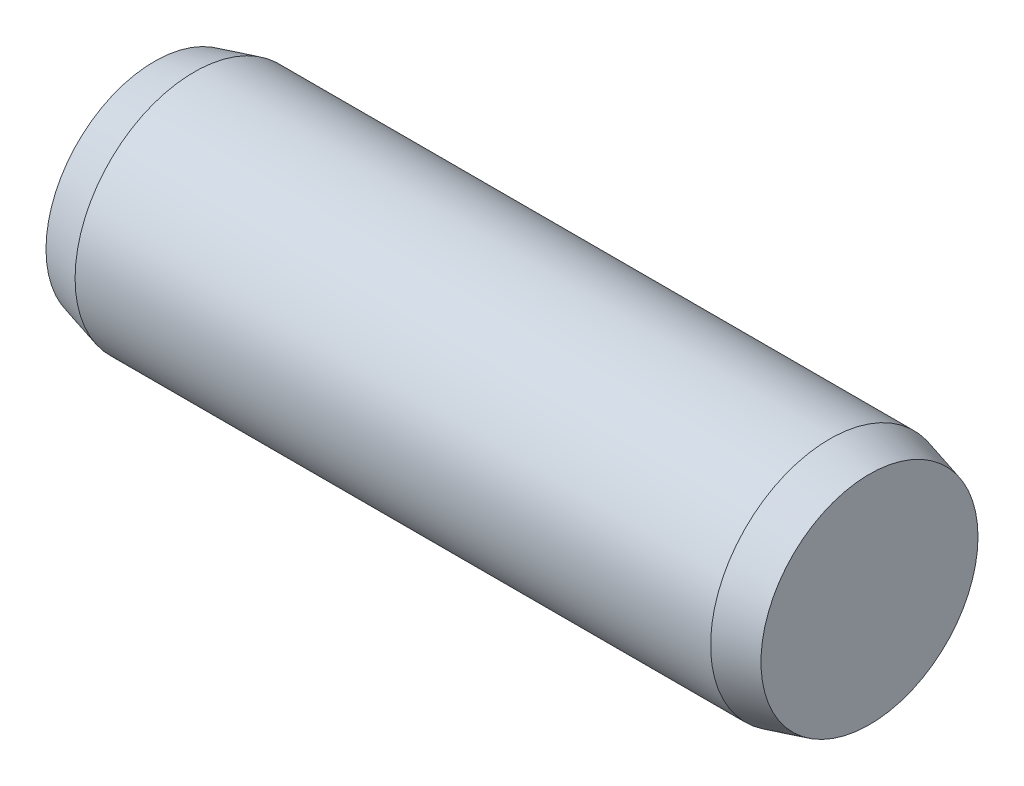
ISO-10303-21;
HEADER;
FILE_DESCRIPTION(('STEP AP214'),'2;1');
FILE_NAME('part.step','',(''),(''),'','','');
FILE_SCHEMA(('AUTOMOTIVE_DESIGN { 1 0 10303 214 1 1 1 1 }'));
ENDSEC;
DATA;
#1=APPLICATION_CONTEXT('core data for automotive mechanical design processes');
#2=APPLICATION_PROTOCOL_DEFINITION('international standard','automotive_design',2000,#1);
#3=PRODUCT_CONTEXT('',#1,'mechanical');
#4=PRODUCT('Part','Part','',(#3));
#5=PRODUCT_RELATED_PRODUCT_CATEGORY('part','',(#4));
#6=PRODUCT_DEFINITION_FORMATION('','',#4);
#7=PRODUCT_DEFINITION_CONTEXT('part definition',#1,'design');
#8=PRODUCT_DEFINITION('design','',#6,#7);
#9=PRODUCT_DEFINITION_SHAPE('','',#8);
#10=(LENGTH_UNIT() NAMED_UNIT(*) SI_UNIT(.MILLI.,.METRE.));
#11=(NAMED_UNIT(*) PLANE_ANGLE_UNIT() SI_UNIT($,.RADIAN.));
#12=(NAMED_UNIT(*) SI_UNIT($,.STERADIAN.) SOLID_ANGLE_UNIT());
#13=UNCERTAINTY_MEASURE_WITH_UNIT(LENGTH_MEASURE(1.E-05),#10,'distance_accuracy_value','');
#14=(GEOMETRIC_REPRESENTATION_CONTEXT(3) GLOBAL_UNCERTAINTY_ASSIGNED_CONTEXT((#13)) GLOBAL_UNIT_ASSIGNED_CONTEXT((#10,
#11,#12)) REPRESENTATION_CONTEXT('',''));
#15=CARTESIAN_POINT('',(0.,0.,0.));
#16=DIRECTION('',(0.,0.,1.));
#17=DIRECTION('',(1.,0.,0.));
#18=AXIS2_PLACEMENT_3D('',#15,#16,#17);
#19=CARTESIAN_POINT('',(-4.,0.,0.));
#20=DIRECTION('',(1.,0.,0.));
#21=DIRECTION('',(0.,0.,-1.));
#22=AXIS2_PLACEMENT_3D('',#19,#20,#21);
#23=CYLINDRICAL_SURFACE('',#22,1.5);
#24=CARTESIAN_POINT('',(-4.,0.,0.));
#25=DIRECTION('',(-1.,0.,0.));
#26=DIRECTION('',(0.,0.,1.));
#27=AXIS2_PLACEMENT_3D('',#24,#25,#26);
#28=CIRCLE('',#27,1.5);
#29=CARTESIAN_POINT('',(-4.,0.,1.5));
#30=VERTEX_POINT('',#29);
#31=EDGE_CURVE('E44',#30,#30,#28,.T.);
#32=ORIENTED_EDGE('',*,*,#31,.F.);
#33=EDGE_LOOP('',(#32));
#34=FACE_BOUND('',#33,.T.);
#35=CARTESIAN_POINT('',(4.,0.,0.));
#36=DIRECTION('',(1.,0.,0.));
#37=DIRECTION('',(0.,0.,-1.));
#38=AXIS2_PLACEMENT_3D('',#35,#36,#37);
#39=CIRCLE('',#38,1.5);
#40=CARTESIAN_POINT('',(4.,0.,-1.5));
#41=VERTEX_POINT('',#40);
#42=EDGE_CURVE('E10',#41,#41,#39,.T.);
#43=ORIENTED_EDGE('',*,*,#42,.F.);
#44=EDGE_LOOP('',(#43));
#45=FACE_BOUND('',#44,.T.);
#46=ADVANCED_FACE('F30',(#34,#45),#23,.T.);
#47=CARTESIAN_POINT('',(4.,0.,0.));
#48=DIRECTION('',(-1.,0.,0.));
#49=DIRECTION('',(0.,0.,-1.));
#50=AXIS2_PLACEMENT_3D('',#47,#48,#49);
#51=CONICAL_SURFACE('',#50,1.5,0.26179938779915);
#52=CARTESIAN_POINT('',(4.5,0.,0.));
#53=DIRECTION('',(1.,0.,0.));
#54=DIRECTION('',(0.,0.,-1.));
#55=AXIS2_PLACEMENT_3D('',#52,#53,#54);
#56=CIRCLE('',#55,1.36602540378444);
#57=CARTESIAN_POINT('',(4.5,0.,-1.36602540378444));
#58=VERTEX_POINT('',#57);
#59=EDGE_CURVE('E36',#58,#58,#56,.T.);
#60=ORIENTED_EDGE('',*,*,#59,.F.);
#61=EDGE_LOOP('',(#60));
#62=FACE_BOUND('',#61,.T.);
#63=ORIENTED_EDGE('',*,*,#42,.T.);
#64=EDGE_LOOP('',(#63));
#65=FACE_BOUND('',#64,.T.);
#66=ADVANCED_FACE('F54',(#62,#65),#51,.T.);
#67=CARTESIAN_POINT('',(4.5,0.,0.));
#68=DIRECTION('',(1.,0.,0.));
#69=DIRECTION('',(0.,0.,-1.));
#70=AXIS2_PLACEMENT_3D('',#67,#68,#69);
#71=PLANE('',#70);
#72=ORIENTED_EDGE('',*,*,#59,.T.);
#73=EDGE_LOOP('',(#72));
#74=FACE_BOUND('',#73,.T.);
#75=ADVANCED_FACE('F58',(#74),#71,.T.);
#76=CARTESIAN_POINT('',(-4.,0.,0.));
#77=DIRECTION('',(1.,0.,0.));
#78=DIRECTION('',(0.,0.,1.));
#79=AXIS2_PLACEMENT_3D('',#76,#77,#78);
#80=CONICAL_SURFACE('',#79,1.5,0.26179938779915);
#81=CARTESIAN_POINT('',(-4.5,0.,0.));
#82=DIRECTION('',(-1.,0.,0.));
#83=DIRECTION('',(0.,0.,1.));
#84=AXIS2_PLACEMENT_3D('',#81,#82,#83);
#85=CIRCLE('',#84,1.36602540378444);
#86=CARTESIAN_POINT('',(-4.5,0.,1.36602540378444));
#87=VERTEX_POINT('',#86);
#88=EDGE_CURVE('E40',#87,#87,#85,.T.);
#89=ORIENTED_EDGE('',*,*,#88,.F.);
#90=EDGE_LOOP('',(#89));
#91=FACE_BOUND('',#90,.T.);
#92=ORIENTED_EDGE('',*,*,#31,.T.);
#93=EDGE_LOOP('',(#92));
#94=FACE_BOUND('',#93,.T.);
#95=ADVANCED_FACE('F50',(#91,#94),#80,.T.);
#96=CARTESIAN_POINT('',(-4.5,0.,0.));
#97=DIRECTION('',(-1.,0.,0.));
#98=DIRECTION('',(0.,0.,1.));
#99=AXIS2_PLACEMENT_3D('',#96,#97,#98);
#100=PLANE('',#99);
#101=ORIENTED_EDGE('',*,*,#88,.T.);
#102=EDGE_LOOP('',(#101));
#103=FACE_BOUND('',#102,.T.);
#104=ADVANCED_FACE('F67',(#103),#100,.T.);
#105=CLOSED_SHELL('',(#46,#66,#75,#95,#104));
#106=MANIFOLD_SOLID_BREP('B2',#105);
#107=ADVANCED_BREP_SHAPE_REPRESENTATION('',(#18,#106),#14);
#108=SHAPE_DEFINITION_REPRESENTATION(#9,#107);
ENDSEC;
END-ISO-10303-21;
